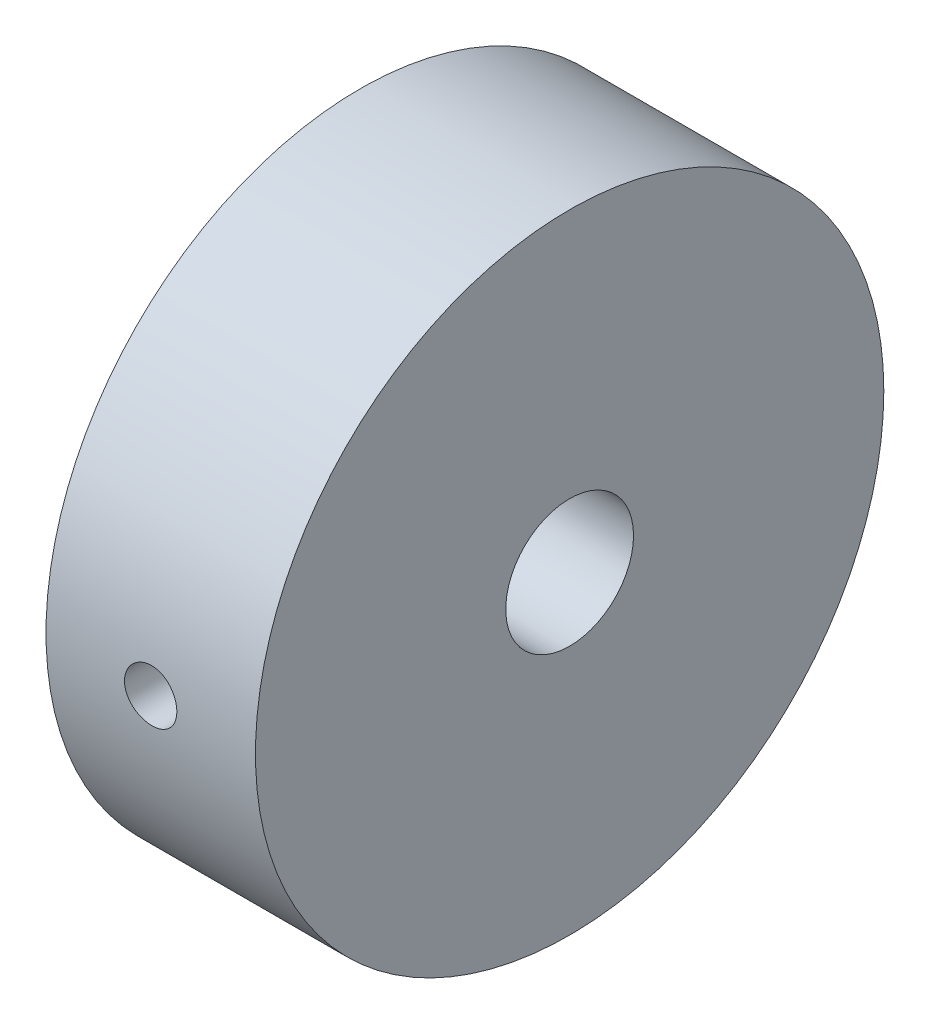
ISO-10303-21;
HEADER;
FILE_DESCRIPTION(('STEP AP214'),'2;1');
FILE_NAME('part.step','',(''),(''),'','','');
FILE_SCHEMA(('AUTOMOTIVE_DESIGN { 1 0 10303 214 1 1 1 1 }'));
ENDSEC;
DATA;
#1=APPLICATION_CONTEXT('core data for automotive mechanical design processes');
#2=APPLICATION_PROTOCOL_DEFINITION('international standard','automotive_design',2000,#1);
#3=PRODUCT_CONTEXT('',#1,'mechanical');
#4=PRODUCT('Part','Part','',(#3));
#5=PRODUCT_RELATED_PRODUCT_CATEGORY('part','',(#4));
#6=PRODUCT_DEFINITION_FORMATION('','',#4);
#7=PRODUCT_DEFINITION_CONTEXT('part definition',#1,'design');
#8=PRODUCT_DEFINITION('design','',#6,#7);
#9=PRODUCT_DEFINITION_SHAPE('','',#8);
#10=(LENGTH_UNIT() NAMED_UNIT(*) SI_UNIT(.MILLI.,.METRE.));
#11=(NAMED_UNIT(*) PLANE_ANGLE_UNIT() SI_UNIT($,.RADIAN.));
#12=(NAMED_UNIT(*) SI_UNIT($,.STERADIAN.) SOLID_ANGLE_UNIT());
#13=UNCERTAINTY_MEASURE_WITH_UNIT(LENGTH_MEASURE(1.E-05),#10,'distance_accuracy_value','');
#14=(GEOMETRIC_REPRESENTATION_CONTEXT(3) GLOBAL_UNCERTAINTY_ASSIGNED_CONTEXT((#13)) GLOBAL_UNIT_ASSIGNED_CONTEXT((#10,
#11,#12)) REPRESENTATION_CONTEXT('',''));
#15=CARTESIAN_POINT('',(0.,0.,0.));
#16=DIRECTION('',(0.,0.,1.));
#17=DIRECTION('',(1.,0.,0.));
#18=AXIS2_PLACEMENT_3D('',#15,#16,#17);
#19=CARTESIAN_POINT('',(10.,0.,0.));
#20=DIRECTION('',(1.,0.,0.));
#21=DIRECTION('',(0.,0.,-1.));
#22=AXIS2_PLACEMENT_3D('',#19,#20,#21);
#23=PLANE('',#22);
#24=CARTESIAN_POINT('',(10.,0.,0.));
#25=DIRECTION('',(1.,0.,0.));
#26=DIRECTION('',(0.,0.,-1.));
#27=AXIS2_PLACEMENT_3D('',#24,#25,#26);
#28=CIRCLE('',#27,15.);
#29=CARTESIAN_POINT('',(10.,0.,-15.));
#30=VERTEX_POINT('',#29);
#31=EDGE_CURVE('E10',#30,#30,#28,.T.);
#32=ORIENTED_EDGE('',*,*,#31,.T.);
#33=EDGE_LOOP('',(#32));
#34=FACE_BOUND('',#33,.T.);
#35=CARTESIAN_POINT('',(10.,0.,0.));
#36=DIRECTION('',(1.,0.,0.));
#37=DIRECTION('',(0.,0.,-1.));
#38=AXIS2_PLACEMENT_3D('',#35,#36,#37);
#39=CIRCLE('',#38,3.05);
#40=CARTESIAN_POINT('',(10.,0.,-3.05));
#41=VERTEX_POINT('',#40);
#42=EDGE_CURVE('E48',#41,#41,#39,.T.);
#43=ORIENTED_EDGE('',*,*,#42,.F.);
#44=EDGE_LOOP('',(#43));
#45=FACE_BOUND('',#44,.T.);
#46=ADVANCED_FACE('F36',(#34,#45),#23,.T.);
#47=CARTESIAN_POINT('',(0.,0.,0.));
#48=DIRECTION('',(1.,0.,0.));
#49=DIRECTION('',(0.,0.,-1.));
#50=AXIS2_PLACEMENT_3D('',#47,#48,#49);
#51=PLANE('',#50);
#52=CARTESIAN_POINT('',(0.,0.,0.));
#53=DIRECTION('',(1.,0.,0.));
#54=DIRECTION('',(0.,0.,-1.));
#55=AXIS2_PLACEMENT_3D('',#52,#53,#54);
#56=CIRCLE('',#55,15.);
#57=CARTESIAN_POINT('',(0.,0.,-15.));
#58=VERTEX_POINT('',#57);
#59=EDGE_CURVE('E41',#58,#58,#56,.T.);
#60=ORIENTED_EDGE('',*,*,#59,.F.);
#61=EDGE_LOOP('',(#60));
#62=FACE_BOUND('',#61,.T.);
#63=CARTESIAN_POINT('',(0.,0.,0.));
#64=DIRECTION('',(1.,0.,0.));
#65=DIRECTION('',(0.,0.,-1.));
#66=AXIS2_PLACEMENT_3D('',#63,#64,#65);
#67=CIRCLE('',#66,3.05);
#68=CARTESIAN_POINT('',(0.,0.,-3.05));
#69=VERTEX_POINT('',#68);
#70=EDGE_CURVE('E50',#69,#69,#67,.T.);
#71=ORIENTED_EDGE('',*,*,#70,.T.);
#72=EDGE_LOOP('',(#71));
#73=FACE_BOUND('',#72,.T.);
#74=ADVANCED_FACE('F79',(#62,#73),#51,.F.);
#75=CARTESIAN_POINT('',(10.,0.,0.));
#76=DIRECTION('',(-1.,0.,0.));
#77=DIRECTION('',(0.,0.,1.));
#78=AXIS2_PLACEMENT_3D('',#75,#76,#77);
#79=CYLINDRICAL_SURFACE('',#78,15.);
#80=CARTESIAN_POINT('',(6.23953452736676,0.,15.));
#81=CARTESIAN_POINT('',(6.246427099155,-0.0696980648042519,14.9999993056206));
#82=CARTESIAN_POINT('',(6.24745375850721,-0.140024125010605,14.9995090149119));
#83=CARTESIAN_POINT('',(6.23771494856616,-0.279895221248509,14.9975519706107));
#84=CARTESIAN_POINT('',(6.2269362945463,-0.349439296205249,14.9960841259584));
#85=CARTESIAN_POINT('',(6.19389408624934,-0.485685034985802,14.9922897438085));
#86=CARTESIAN_POINT('',(6.17163665449803,-0.552388193579308,14.9899636642624));
#87=CARTESIAN_POINT('',(6.11628393410532,-0.681087416654878,14.9846679084029));
#88=CARTESIAN_POINT('',(6.08319093950959,-0.743084474067316,14.9816983683644));
#89=CARTESIAN_POINT('',(6.00703217245335,-0.860765684921693,14.9753986989294));
#90=CARTESIAN_POINT('',(5.96394738831306,-0.916437498396699,14.9720678886469));
#91=CARTESIAN_POINT('',(5.86905348822939,-1.01977200984106,14.9653851216751));
#92=CARTESIAN_POINT('',(5.81724393677742,-1.06743430776718,14.9620331639383));
#93=CARTESIAN_POINT('',(5.70622274847984,-1.15351186154849,14.9556438540203));
#94=CARTESIAN_POINT('',(5.64699369539079,-1.19190471664346,14.9526072738729));
#95=CARTESIAN_POINT('',(5.52290411271515,-1.25820323359002,14.9471748497022));
#96=CARTESIAN_POINT('',(5.45804364458008,-1.28610900986172,14.9447789986882));
#97=CARTESIAN_POINT('',(5.32462257456701,-1.33060152309186,14.9408835500598));
#98=CARTESIAN_POINT('',(5.25606715136969,-1.34720367927218,14.9393827318833));
#99=CARTESIAN_POINT('',(5.11712851361944,-1.36866907903134,14.9374316091635));
#100=CARTESIAN_POINT('',(5.04674534039594,-1.37353258781338,14.9369812808874));
#101=CARTESIAN_POINT('',(4.90637602611589,-1.37138312214829,14.9371787532886));
#102=CARTESIAN_POINT('',(4.83638932807354,-1.36440602398919,14.9378232367618));
#103=CARTESIAN_POINT('',(4.69858624745646,-1.33884608738129,14.9401356632421));
#104=CARTESIAN_POINT('',(4.63076986871242,-1.32026322844908,14.9418036080557));
#105=CARTESIAN_POINT('',(4.49922209898079,-1.27202470429381,14.9459872650311));
#106=CARTESIAN_POINT('',(4.43549090700035,-1.24236850011974,14.9485030184561));
#107=CARTESIAN_POINT('',(4.31390648592987,-1.17282628424642,14.9541195113257));
#108=CARTESIAN_POINT('',(4.25605337556388,-1.13294006598119,14.9572202625823));
#109=CARTESIAN_POINT('',(4.14767894427971,-1.04392405566523,14.9636965445462));
#110=CARTESIAN_POINT('',(4.09718048657812,-0.994766484998712,14.9670728832566));
#111=CARTESIAN_POINT('',(4.00514754911718,-0.888669752896687,14.9737465434148));
#112=CARTESIAN_POINT('',(3.9636131488117,-0.83173052249492,14.9770438641621));
#113=CARTESIAN_POINT('',(3.89063731136022,-0.711592018645189,14.9832324283918));
#114=CARTESIAN_POINT('',(3.85920902595875,-0.648384726917186,14.9861231399988));
#115=CARTESIAN_POINT('',(3.8074215363313,-0.517561288861533,14.9912111292367));
#116=CARTESIAN_POINT('',(3.78706214166695,-0.449945218408585,14.9934084187974));
#117=CARTESIAN_POINT('',(3.75803795593826,-0.312399214121974,14.9969038671067));
#118=CARTESIAN_POINT('',(3.74934454318826,-0.242475376138013,14.9982042225941));
#119=CARTESIAN_POINT('',(3.74381215261917,-0.102149561032734,14.9998162729772));
#120=CARTESIAN_POINT('',(3.74697298628738,-0.0317475915326965,15.0001279835948));
#121=CARTESIAN_POINT('',(3.76503493298145,0.107360372455925,14.9997767283518));
#122=CARTESIAN_POINT('',(3.77990820297841,0.176069991058649,14.9991160707909));
#123=CARTESIAN_POINT('',(3.82093151722052,0.310021502640852,14.9969455883746));
#124=CARTESIAN_POINT('',(3.84708166824724,0.375263362777319,14.9954357554783));
#125=CARTESIAN_POINT('',(3.90995594139254,0.500529888282005,14.9917779564056));
#126=CARTESIAN_POINT('',(3.94669479297649,0.560547133448228,14.9896291011806));
#127=CARTESIAN_POINT('',(4.0296918093153,0.673577626680424,14.9849757515774));
#128=CARTESIAN_POINT('',(4.0759501721374,0.72659072897735,14.9824712497998));
#129=CARTESIAN_POINT('',(4.17683870652722,0.824272119693833,14.9774156739007));
#130=CARTESIAN_POINT('',(4.23149358817376,0.868914884804583,14.9748644825599));
#131=CARTESIAN_POINT('',(4.34753331246649,0.948392285142023,14.9700415058517));
#132=CARTESIAN_POINT('',(4.40891814434549,0.983226936060287,14.9677697200373));
#133=CARTESIAN_POINT('',(4.53668057035505,1.04209010956607,14.9637870531099));
#134=CARTESIAN_POINT('',(4.60305786247316,1.06611928520413,14.9620761381013));
#135=CARTESIAN_POINT('',(4.73892166837471,1.10267867501381,14.9594264213583));
#136=CARTESIAN_POINT('',(4.80840812163089,1.11520911293376,14.9584876046001));
#137=CARTESIAN_POINT('',(4.94829086865919,1.12838570185797,14.9574994642122));
#138=CARTESIAN_POINT('',(5.01868374286217,1.12906796706222,14.9574474375826));
#139=CARTESIAN_POINT('',(5.15858195304347,1.11862096323601,14.9582323053261));
#140=CARTESIAN_POINT('',(5.22808729488332,1.10749177225298,14.9590691938255));
#141=CARTESIAN_POINT('',(5.36414938753244,1.07376676751135,14.9615275781406));
#142=CARTESIAN_POINT('',(5.43070973282133,1.0511853762736,14.9631480869718));
#143=CARTESIAN_POINT('',(5.55909757896909,0.995212969872271,14.9669747630613));
#144=CARTESIAN_POINT('',(5.6209251705907,0.961822162071324,14.9691809190846));
#145=CARTESIAN_POINT('',(5.73825771587563,0.885087307312939,14.9739138674568));
#146=CARTESIAN_POINT('',(5.79374719313491,0.841719644890064,14.9764414140932));
#147=CARTESIAN_POINT('',(5.89668817455055,0.746286909832979,14.9814996897172));
#148=CARTESIAN_POINT('',(5.94413768035998,0.694219681276752,14.9840304193389));
#149=CARTESIAN_POINT('',(6.02976655852217,0.582709543767788,14.9887814567867));
#150=CARTESIAN_POINT('',(6.06791939267374,0.523246235283227,14.9910008684482));
#151=CARTESIAN_POINT('',(6.13366125466358,0.39878274484429,14.9948268273853));
#152=CARTESIAN_POINT('',(6.16126232343848,0.333788978075778,14.9964340732141));
#153=CARTESIAN_POINT('',(6.19742299584718,0.223678532572676,14.9983950193863));
#154=CARTESIAN_POINT('',(6.20926535888812,0.179614992726612,14.9989908088408));
#155=CARTESIAN_POINT('',(6.22807819637977,0.0904563011580241,14.9997935248037));
#156=CARTESIAN_POINT('',(6.23504867842891,0.0453611510445676,15.0000004519185));
#157=CARTESIAN_POINT('',(6.23953452736676,0.,15.));
#158=B_SPLINE_CURVE_WITH_KNOTS('',3,(#80,#81,#82,#83,#84,#85,#86,#87,#88,#89,#90,#91,#92,#93,
#94,#95,#96,#97,#98,#99,#100,#101,#102,#103,#104,#105,#106,#107,#108,#109,#110,#111,#112,#113,
#114,#115,#116,#117,#118,#119,#120,#121,#122,#123,#124,#125,#126,#127,#128,#129,#130,#131,#132,
#133,#134,#135,#136,#137,#138,#139,#140,#141,#142,#143,#144,#145,#146,#147,#148,#149,#150,#151,
#152,#153,#154,#155,#156,#157),.UNSPECIFIED.,.T.,.F.,(4,2,2,2,2,2,2,2,2,2,2,2,2,2,2,2,2,2,2,2,2,
2,2,2,2,2,2,2,2,2,2,2,2,2,2,2,2,2,4),(0.,0.209947933556097,0.420130586116692,0.630201247671456,
0.840227462949726,1.05065662864454,1.26109630131168,1.47203954840444,1.68298049391708,
1.89363311613496,2.10428097917828,2.31429173146683,2.52430285441152,2.73432420014458,
2.94434978699449,3.15501494281636,3.36568196581446,3.57662204430323,3.78755849348913,
3.99797647258679,4.20839110551706,4.41830704121957,4.62822496467404,4.83843631663769,
5.04865204279587,5.25949870124027,5.47034502235841,5.68117859884341,5.89200807273323,
6.102194807955,6.31238015431882,6.52230145511628,6.73221872912344,6.94263809027688,
7.15310967500289,7.36417521079949,7.57499916927815,7.71163846917357,7.84827755595854),.UNSPECIFIED.);
#159=CARTESIAN_POINT('',(6.23953452736676,0.,15.));
#160=VERTEX_POINT('',#159);
#161=EDGE_CURVE('E53',#160,#160,#158,.T.);
#162=ORIENTED_EDGE('',*,*,#161,.T.);
#163=EDGE_LOOP('',(#162));
#164=FACE_BOUND('',#163,.T.);
#165=ORIENTED_EDGE('',*,*,#31,.F.);
#166=EDGE_LOOP('',(#165));
#167=FACE_BOUND('',#166,.T.);
#168=ORIENTED_EDGE('',*,*,#59,.T.);
#169=EDGE_LOOP('',(#168));
#170=FACE_BOUND('',#169,.T.);
#171=ADVANCED_FACE('F38',(#164,#167,#170),#79,.T.);
#172=CARTESIAN_POINT('',(10.,0.,0.));
#173=DIRECTION('',(-1.,0.,0.));
#174=DIRECTION('',(0.,0.,1.));
#175=AXIS2_PLACEMENT_3D('',#172,#173,#174);
#176=CYLINDRICAL_SURFACE('',#175,3.05);
#177=CARTESIAN_POINT('',(6.24535754874462,0.,3.05));
#178=CARTESIAN_POINT('',(6.24668868960341,-0.0668261443544864,3.04999482855232));
#179=CARTESIAN_POINT('',(6.24264501615426,-0.133867456386108,3.04777827817952));
#180=CARTESIAN_POINT('',(6.22392359232437,-0.266273955869168,3.03908355466352));
#181=CARTESIAN_POINT('',(6.20921823008729,-0.331634333992304,3.03259432005271));
#182=CARTESIAN_POINT('',(6.16980556514412,-0.458543514635441,3.01601039654589));
#183=CARTESIAN_POINT('',(6.14513027995696,-0.520103798084107,3.00592726124401));
#184=CARTESIAN_POINT('',(6.08662658664082,-0.638117821523417,2.98310627317535));
#185=CARTESIAN_POINT('',(6.05280104648712,-0.694573154179609,2.97036925250595));
#186=CARTESIAN_POINT('',(5.97529018304055,-0.803527775339218,2.94281087880059));
#187=CARTESIAN_POINT('',(5.93124429101474,-0.855753654825804,2.92792357249366));
#188=CARTESIAN_POINT('',(5.83525166328225,-0.952329786089749,2.89795269428135));
#189=CARTESIAN_POINT('',(5.78330082175272,-0.996675919035898,2.88286902412949));
#190=CARTESIAN_POINT('',(5.66974142820149,-1.07853051543655,2.853290262102));
#191=CARTESIAN_POINT('',(5.60777260144244,-1.11556739186825,2.83886583156628));
#192=CARTESIAN_POINT('',(5.47783692915659,-1.1786178026943,2.81327661949741));
#193=CARTESIAN_POINT('',(5.40987262093238,-1.2046359734465,2.80211046758959));
#194=CARTESIAN_POINT('',(5.27272444736408,-1.24378651565131,2.78494848033571));
#195=CARTESIAN_POINT('',(5.20370323774406,-1.25740093754486,2.7787604337927));
#196=CARTESIAN_POINT('',(5.06410329418791,-1.27287753505802,2.77170719014823));
#197=CARTESIAN_POINT('',(4.99352549907486,-1.27474661009688,2.77083886815637));
#198=CARTESIAN_POINT('',(4.8586072889416,-1.2669707076293,2.77440001702025));
#199=CARTESIAN_POINT('',(4.79420344831798,-1.25819732388094,2.77842850312247));
#200=CARTESIAN_POINT('',(4.66789396559354,-1.23094485239011,2.79060832925858));
#201=CARTESIAN_POINT('',(4.60598873469693,-1.21246417404377,2.79876034495171));
#202=CARTESIAN_POINT('',(4.48538559403761,-1.16614572052609,2.81837548701431));
#203=CARTESIAN_POINT('',(4.4267422622147,-1.13818499832309,2.82988182569387));
#204=CARTESIAN_POINT('',(4.31479383817596,-1.07378088713084,2.85494067987106));
#205=CARTESIAN_POINT('',(4.26149074398005,-1.03733434004478,2.86849395649869));
#206=CARTESIAN_POINT('',(4.15715631365302,-0.953506166815831,2.89748952101066));
#207=CARTESIAN_POINT('',(4.10666241929759,-0.905476221902203,2.91299579013547));
#208=CARTESIAN_POINT('',(4.01425935789443,-0.80154629130455,2.94328922158678));
#209=CARTESIAN_POINT('',(3.97235246569044,-0.745644226762072,2.95807619256976));
#210=CARTESIAN_POINT('',(3.89721791162251,-0.625525900229155,2.98581942486932));
#211=CARTESIAN_POINT('',(3.86426963368101,-0.561119025190341,2.99871198635264));
#212=CARTESIAN_POINT('',(3.80987711813337,-0.427019815012423,3.02072167843052));
#213=CARTESIAN_POINT('',(3.78842704361844,-0.35733018214214,3.02984072406264));
#214=CARTESIAN_POINT('',(3.75885011582585,-0.218994156873543,3.04287428001747));
#215=CARTESIAN_POINT('',(3.75001878035572,-0.150524233264773,3.04706146686943));
#216=CARTESIAN_POINT('',(3.74377223960372,-0.0129491479412206,3.05074768535972));
#217=CARTESIAN_POINT('',(3.74635345571649,0.0561558078663385,3.05024818653528));
#218=CARTESIAN_POINT('',(3.76237470500181,0.189250956263458,3.04481434679723));
#219=CARTESIAN_POINT('',(3.77524503270665,0.25332061456926,3.04011118901706));
#220=CARTESIAN_POINT('',(3.81063100005988,0.378344223929582,3.02709570812867));
#221=CARTESIAN_POINT('',(3.83314769464302,0.43929783339408,3.01878299027459));
#222=CARTESIAN_POINT('',(3.88777441061668,0.55814896808941,2.99911551203163));
#223=CARTESIAN_POINT('',(3.92011678532835,0.615927195614361,2.98768785182495));
#224=CARTESIAN_POINT('',(3.99324178976469,0.725440039977196,2.96300403595576));
#225=CARTESIAN_POINT('',(4.0340277212805,0.777172280157442,2.94974716567238));
#226=CARTESIAN_POINT('',(4.126192171132,0.87690545795373,2.92171253890259));
#227=CARTESIAN_POINT('',(4.1781096047009,0.924397774105549,2.90689309765708));
#228=CARTESIAN_POINT('',(4.28934027408576,1.01015393375752,2.87821793793291));
#229=CARTESIAN_POINT('',(4.34865544229971,1.04841535832079,2.8643624727377));
#230=CARTESIAN_POINT('',(4.47451821878793,1.11521895760384,2.83903013078187));
#231=CARTESIAN_POINT('',(4.54118100279431,1.14356450743621,2.82760296727992));
#232=CARTESIAN_POINT('',(4.67894125680022,1.18837733539258,2.80906690300189));
#233=CARTESIAN_POINT('',(4.75003528223766,1.20485371775553,2.80195469310507));
#234=CARTESIAN_POINT('',(4.88916314334342,1.22441650454925,2.79345832572013));
#235=CARTESIAN_POINT('',(4.95705136306155,1.2283775633613,2.79170033044127));
#236=CARTESIAN_POINT('',(5.09250826134708,1.22520161962674,2.79309592300174));
#237=CARTESIAN_POINT('',(5.1600770015276,1.21806685249536,2.79624852153087));
#238=CARTESIAN_POINT('',(5.2894744177389,1.1936713768822,2.80674352672909));
#239=CARTESIAN_POINT('',(5.35142124639834,1.17693403907779,2.81386887873922));
#240=CARTESIAN_POINT('',(5.47163273840393,1.13437676184595,2.8312920916495));
#241=CARTESIAN_POINT('',(5.52989641440031,1.10855439905648,2.84159079892717));
#242=CARTESIAN_POINT('',(5.6445156139936,1.04698239082053,2.86486727083606));
#243=CARTESIAN_POINT('',(5.70060141108509,1.01077477667759,2.87795905681884));
#244=CARTESIAN_POINT('',(5.8061998252081,0.930057477493157,2.90504796029823));
#245=CARTESIAN_POINT('',(5.85571026688843,0.885545056593543,2.91904537514129));
#246=CARTESIAN_POINT('',(5.95048198451075,0.78564511656503,2.94756660838743));
#247=CARTESIAN_POINT('',(5.99517022440173,0.729701301503859,2.96205439339146));
#248=CARTESIAN_POINT('',(6.07460192189856,0.610619437907211,2.98887329154561));
#249=CARTESIAN_POINT('',(6.10934024294347,0.547477696932227,3.00120328948347));
#250=CARTESIAN_POINT('',(6.1673334116761,0.416388222065984,3.02216478739654));
#251=CARTESIAN_POINT('',(6.19070956387733,0.348500526382399,3.03083521981893));
#252=CARTESIAN_POINT('',(6.22550421322368,0.209450219193157,3.04359406859345));
#253=CARTESIAN_POINT('',(6.23696052646196,0.138298716946338,3.04769697848135));
#254=CARTESIAN_POINT('',(6.24387215217754,0.0445432654562448,3.04975755889424));
#255=CARTESIAN_POINT('',(6.24491367150948,0.0222835953052792,3.05000172445153));
#256=CARTESIAN_POINT('',(6.24535754874462,0.,3.05));
#257=B_SPLINE_CURVE_WITH_KNOTS('',3,(#177,#178,#179,#180,#181,#182,#183,#184,#185,#186,#187,
#188,#189,#190,#191,#192,#193,#194,#195,#196,#197,#198,#199,#200,#201,#202,#203,#204,#205,#206,
#207,#208,#209,#210,#211,#212,#213,#214,#215,#216,#217,#218,#219,#220,#221,#222,#223,#224,#225,
#226,#227,#228,#229,#230,#231,#232,#233,#234,#235,#236,#237,#238,#239,#240,#241,#242,#243,#244,
#245,#246,#247,#248,#249,#250,#251,#252,#253,#254,#255,#256),.UNSPECIFIED.,.T.,.F.,(4,2,2,2,2,2,
2,2,2,2,2,2,2,2,2,2,2,2,2,2,2,2,2,2,2,2,2,2,2,2,2,2,2,2,2,2,2,2,2,4),(0.,0.200455636442936,
0.401432279837195,0.60176857046948,0.802042142068829,1.01090275554134,1.21987222366045,
1.43963712817963,1.65930946978283,1.87002692053638,2.08062058064678,2.27507180788511,
2.46955490717576,2.66666340377961,2.86384537415278,3.0770660048628,3.2903430485437,
3.50965967074591,3.7288648541186,3.93527731240201,4.14162505103632,4.33727854800885,
4.53295344727592,4.73367289511479,4.9344709815894,5.14921380095343,5.36401283227467,
5.58285739741107,5.80153391867294,6.00454528810627,6.20751576324994,6.40035200840813,
6.59323973023031,6.79646766091588,6.99976265970897,7.21788057752166,7.43611089473669,
7.65195717228306,7.86711656261261,7.93395974685293),.UNSPECIFIED.);
#258=CARTESIAN_POINT('',(6.24535754874462,0.,3.05));
#259=VERTEX_POINT('',#258);
#260=EDGE_CURVE('E62',#259,#259,#257,.T.);
#261=ORIENTED_EDGE('',*,*,#260,.F.);
#262=EDGE_LOOP('',(#261));
#263=FACE_BOUND('',#262,.T.);
#264=ORIENTED_EDGE('',*,*,#42,.T.);
#265=EDGE_LOOP('',(#264));
#266=FACE_BOUND('',#265,.T.);
#267=ORIENTED_EDGE('',*,*,#70,.F.);
#268=EDGE_LOOP('',(#267));
#269=FACE_BOUND('',#268,.T.);
#270=ADVANCED_FACE('F70',(#263,#266,#269),#176,.F.);
#271=CARTESIAN_POINT('',(4.99560807109606,-0.123073032748083,14.999495092456));
#272=DIRECTION('',(0.,-0.00820486884987282,0.999966339497064));
#273=DIRECTION('',(0.,-0.999966339497064,-0.00820486884987282));
#274=AXIS2_PLACEMENT_3D('',#271,#272,#273);
#275=CYLINDRICAL_SURFACE('',#274,1.24999999999999);
#276=ORIENTED_EDGE('',*,*,#260,.T.);
#277=EDGE_LOOP('',(#276));
#278=FACE_BOUND('',#277,.T.);
#279=ORIENTED_EDGE('',*,*,#161,.F.);
#280=EDGE_LOOP('',(#279));
#281=FACE_BOUND('',#280,.T.);
#282=ADVANCED_FACE('F67',(#278,#281),#275,.F.);
#283=CLOSED_SHELL('',(#46,#74,#171,#270,#282));
#284=MANIFOLD_SOLID_BREP('B2',#283);
#285=ADVANCED_BREP_SHAPE_REPRESENTATION('',(#18,#284),#14);
#286=SHAPE_DEFINITION_REPRESENTATION(#9,#285);
ENDSEC;
END-ISO-10303-21;
